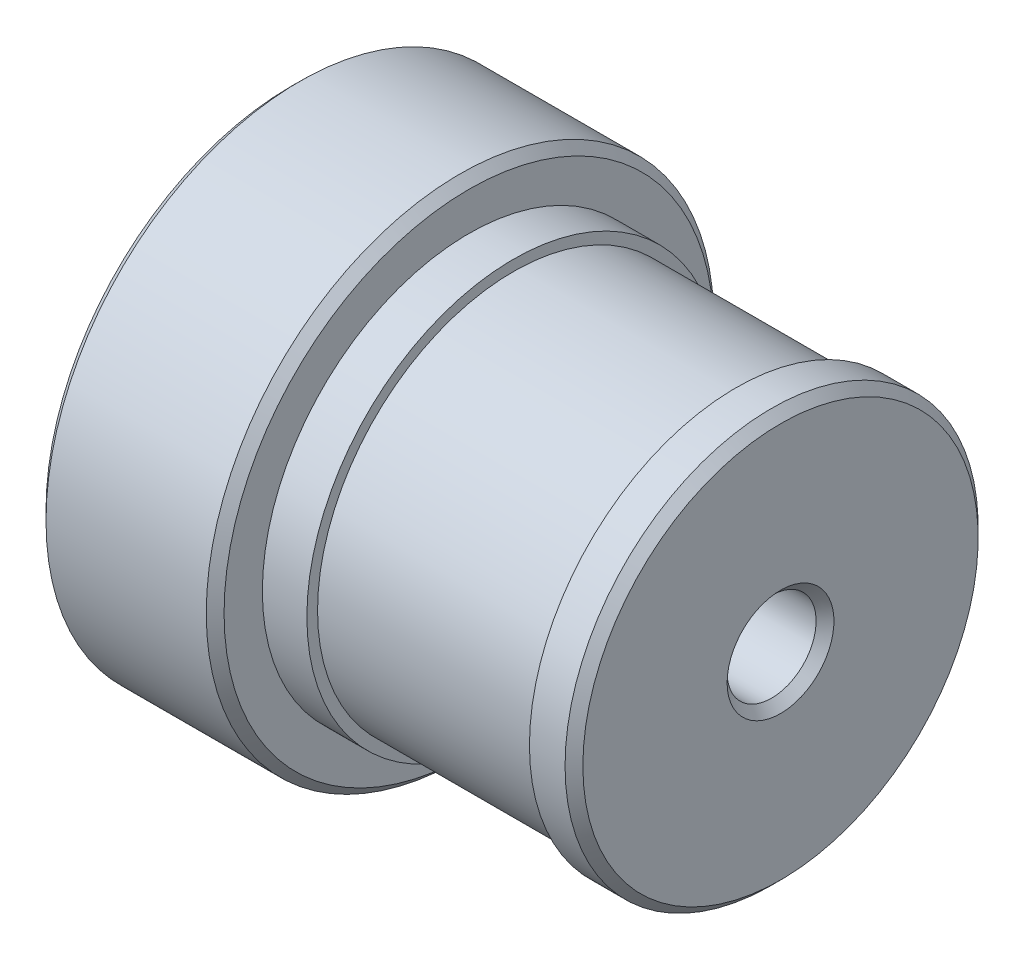
ISO-10303-21;
HEADER;
FILE_DESCRIPTION(('STEP AP214'),'2;1');
FILE_NAME('part.step','',(''),(''),'','','');
FILE_SCHEMA(('AUTOMOTIVE_DESIGN { 1 0 10303 214 1 1 1 1 }'));
ENDSEC;
DATA;
#1=APPLICATION_CONTEXT('core data for automotive mechanical design processes');
#2=APPLICATION_PROTOCOL_DEFINITION('international standard','automotive_design',2000,#1);
#3=PRODUCT_CONTEXT('',#1,'mechanical');
#4=PRODUCT('Part','Part','',(#3));
#5=PRODUCT_RELATED_PRODUCT_CATEGORY('part','',(#4));
#6=PRODUCT_DEFINITION_FORMATION('','',#4);
#7=PRODUCT_DEFINITION_CONTEXT('part definition',#1,'design');
#8=PRODUCT_DEFINITION('design','',#6,#7);
#9=PRODUCT_DEFINITION_SHAPE('','',#8);
#10=(LENGTH_UNIT() NAMED_UNIT(*) SI_UNIT(.MILLI.,.METRE.));
#11=(NAMED_UNIT(*) PLANE_ANGLE_UNIT() SI_UNIT($,.RADIAN.));
#12=(NAMED_UNIT(*) SI_UNIT($,.STERADIAN.) SOLID_ANGLE_UNIT());
#13=UNCERTAINTY_MEASURE_WITH_UNIT(LENGTH_MEASURE(1.E-05),#10,'distance_accuracy_value','');
#14=(GEOMETRIC_REPRESENTATION_CONTEXT(3) GLOBAL_UNCERTAINTY_ASSIGNED_CONTEXT((#13)) GLOBAL_UNIT_ASSIGNED_CONTEXT((#10,
#11,#12)) REPRESENTATION_CONTEXT('',''));
#15=CARTESIAN_POINT('',(0.,0.,0.));
#16=DIRECTION('',(0.,0.,1.));
#17=DIRECTION('',(1.,0.,0.));
#18=AXIS2_PLACEMENT_3D('',#15,#16,#17);
#19=CARTESIAN_POINT('',(20.,23.2,0.));
#20=DIRECTION('',(-1.,0.,0.));
#21=DIRECTION('',(0.,0.,1.));
#22=AXIS2_PLACEMENT_3D('',#19,#20,#21);
#23=PLANE('',#22);
#24=CARTESIAN_POINT('',(20.,0.,0.));
#25=DIRECTION('',(-1.,0.,0.));
#26=DIRECTION('',(0.,0.,1.));
#27=AXIS2_PLACEMENT_3D('',#24,#25,#26);
#28=CIRCLE('',#27,27.5);
#29=CARTESIAN_POINT('',(20.,0.,27.5));
#30=VERTEX_POINT('',#29);
#31=EDGE_CURVE('E59',#30,#30,#28,.F.);
#32=ORIENTED_EDGE('',*,*,#31,.T.);
#33=EDGE_LOOP('',(#32));
#34=FACE_BOUND('',#33,.T.);
#35=CARTESIAN_POINT('',(20.,0.,0.));
#36=DIRECTION('',(-1.,0.,0.));
#37=DIRECTION('',(0.,0.,1.));
#38=AXIS2_PLACEMENT_3D('',#35,#36,#37);
#39=CIRCLE('',#38,23.2);
#40=CARTESIAN_POINT('',(20.,0.,23.2));
#41=VERTEX_POINT('',#40);
#42=EDGE_CURVE('E110',#41,#41,#39,.T.);
#43=ORIENTED_EDGE('',*,*,#42,.T.);
#44=EDGE_LOOP('',(#43));
#45=FACE_BOUND('',#44,.T.);
#46=ADVANCED_FACE('F45',(#34,#45),#23,.F.);
#47=CARTESIAN_POINT('',(0.,0.,0.));
#48=DIRECTION('',(-1.,0.,0.));
#49=DIRECTION('',(0.,0.,1.));
#50=AXIS2_PLACEMENT_3D('',#47,#48,#49);
#51=CYLINDRICAL_SURFACE('',#50,28.5);
#52=CARTESIAN_POINT('',(19.,0.,0.));
#53=DIRECTION('',(-1.,0.,0.));
#54=DIRECTION('',(0.,0.,1.));
#55=AXIS2_PLACEMENT_3D('',#52,#53,#54);
#56=CIRCLE('',#55,28.5);
#57=CARTESIAN_POINT('',(19.,0.,28.5));
#58=VERTEX_POINT('',#57);
#59=EDGE_CURVE('E64',#58,#58,#56,.T.);
#60=ORIENTED_EDGE('',*,*,#59,.T.);
#61=EDGE_LOOP('',(#60));
#62=FACE_BOUND('',#61,.T.);
#63=CARTESIAN_POINT('',(0.999999999999991,0.,0.));
#64=DIRECTION('',(1.,0.,0.));
#65=DIRECTION('',(0.,0.,-1.));
#66=AXIS2_PLACEMENT_3D('',#63,#64,#65);
#67=CIRCLE('',#66,28.5);
#68=CARTESIAN_POINT('',(0.999999999999991,0.,-28.5));
#69=VERTEX_POINT('',#68);
#70=EDGE_CURVE('E70',#69,#69,#67,.T.);
#71=ORIENTED_EDGE('',*,*,#70,.T.);
#72=EDGE_LOOP('',(#71));
#73=FACE_BOUND('',#72,.T.);
#74=ADVANCED_FACE('F154',(#62,#73),#51,.T.);
#75=CARTESIAN_POINT('',(0.,5.,0.));
#76=DIRECTION('',(1.,0.,0.));
#77=DIRECTION('',(0.,0.,-1.));
#78=AXIS2_PLACEMENT_3D('',#75,#76,#77);
#79=PLANE('',#78);
#80=CARTESIAN_POINT('',(0.,0.,0.));
#81=DIRECTION('',(1.,0.,0.));
#82=DIRECTION('',(0.,0.,-1.));
#83=AXIS2_PLACEMENT_3D('',#80,#81,#82);
#84=CIRCLE('',#83,6.00000000000001);
#85=CARTESIAN_POINT('',(0.,0.,-6.00000000000001));
#86=VERTEX_POINT('',#85);
#87=EDGE_CURVE('E10',#86,#86,#84,.T.);
#88=ORIENTED_EDGE('',*,*,#87,.T.);
#89=EDGE_LOOP('',(#88));
#90=FACE_BOUND('',#89,.T.);
#91=CARTESIAN_POINT('',(0.,0.,0.));
#92=DIRECTION('',(1.,0.,0.));
#93=DIRECTION('',(0.,0.,-1.));
#94=AXIS2_PLACEMENT_3D('',#91,#92,#93);
#95=CIRCLE('',#94,27.5);
#96=CARTESIAN_POINT('',(0.,0.,-27.5));
#97=VERTEX_POINT('',#96);
#98=EDGE_CURVE('E54',#97,#97,#95,.F.);
#99=ORIENTED_EDGE('',*,*,#98,.T.);
#100=EDGE_LOOP('',(#99));
#101=FACE_BOUND('',#100,.T.);
#102=ADVANCED_FACE('F160',(#90,#101),#79,.F.);
#103=CARTESIAN_POINT('',(0.,0.,0.));
#104=DIRECTION('',(-1.,0.,0.));
#105=DIRECTION('',(0.,0.,1.));
#106=AXIS2_PLACEMENT_3D('',#103,#104,#105);
#107=CYLINDRICAL_SURFACE('',#106,5.);
#108=CARTESIAN_POINT('',(54.,0.,0.));
#109=DIRECTION('',(-1.,0.,0.));
#110=DIRECTION('',(0.,0.,1.));
#111=AXIS2_PLACEMENT_3D('',#108,#109,#110);
#112=CIRCLE('',#111,5.);
#113=CARTESIAN_POINT('',(54.,0.,5.));
#114=VERTEX_POINT('',#113);
#115=EDGE_CURVE('E78',#114,#114,#112,.F.);
#116=ORIENTED_EDGE('',*,*,#115,.T.);
#117=EDGE_LOOP('',(#116));
#118=FACE_BOUND('',#117,.T.);
#119=CARTESIAN_POINT('',(0.999999999999995,0.,0.));
#120=DIRECTION('',(1.,0.,0.));
#121=DIRECTION('',(0.,0.,-1.));
#122=AXIS2_PLACEMENT_3D('',#119,#120,#121);
#123=CIRCLE('',#122,5.);
#124=CARTESIAN_POINT('',(0.999999999999995,0.,-5.));
#125=VERTEX_POINT('',#124);
#126=EDGE_CURVE('E82',#125,#125,#123,.F.);
#127=ORIENTED_EDGE('',*,*,#126,.T.);
#128=EDGE_LOOP('',(#127));
#129=FACE_BOUND('',#128,.T.);
#130=ADVANCED_FACE('F150',(#118,#129),#107,.F.);
#131=CARTESIAN_POINT('',(55.,23.2,0.));
#132=DIRECTION('',(-1.,0.,0.));
#133=DIRECTION('',(0.,0.,1.));
#134=AXIS2_PLACEMENT_3D('',#131,#132,#133);
#135=PLANE('',#134);
#136=CARTESIAN_POINT('',(55.,0.,0.));
#137=DIRECTION('',(-1.,0.,0.));
#138=DIRECTION('',(0.,0.,1.));
#139=AXIS2_PLACEMENT_3D('',#136,#137,#138);
#140=CIRCLE('',#139,6.00000000000001);
#141=CARTESIAN_POINT('',(55.,0.,6.00000000000001));
#142=VERTEX_POINT('',#141);
#143=EDGE_CURVE('E86',#142,#142,#140,.T.);
#144=ORIENTED_EDGE('',*,*,#143,.T.);
#145=EDGE_LOOP('',(#144));
#146=FACE_BOUND('',#145,.T.);
#147=CARTESIAN_POINT('',(55.,0.,0.));
#148=DIRECTION('',(-1.,0.,0.));
#149=DIRECTION('',(0.,0.,1.));
#150=AXIS2_PLACEMENT_3D('',#147,#148,#149);
#151=CIRCLE('',#150,22.2);
#152=CARTESIAN_POINT('',(55.,0.,22.2));
#153=VERTEX_POINT('',#152);
#154=EDGE_CURVE('E90',#153,#153,#151,.F.);
#155=ORIENTED_EDGE('',*,*,#154,.T.);
#156=EDGE_LOOP('',(#155));
#157=FACE_BOUND('',#156,.T.);
#158=ADVANCED_FACE('F143',(#146,#157),#135,.F.);
#159=CARTESIAN_POINT('',(0.,0.,0.));
#160=DIRECTION('',(-1.,0.,0.));
#161=DIRECTION('',(0.,0.,1.));
#162=AXIS2_PLACEMENT_3D('',#159,#160,#161);
#163=CYLINDRICAL_SURFACE('',#162,23.2);
#164=CARTESIAN_POINT('',(54.,0.,0.));
#165=DIRECTION('',(-1.,0.,0.));
#166=DIRECTION('',(0.,0.,1.));
#167=AXIS2_PLACEMENT_3D('',#164,#165,#166);
#168=CIRCLE('',#167,23.2);
#169=CARTESIAN_POINT('',(54.,0.,23.2));
#170=VERTEX_POINT('',#169);
#171=EDGE_CURVE('E74',#170,#170,#168,.T.);
#172=ORIENTED_EDGE('',*,*,#171,.T.);
#173=EDGE_LOOP('',(#172));
#174=FACE_BOUND('',#173,.T.);
#175=CARTESIAN_POINT('',(50.,0.,0.));
#176=DIRECTION('',(-1.,0.,0.));
#177=DIRECTION('',(0.,0.,1.));
#178=AXIS2_PLACEMENT_3D('',#175,#176,#177);
#179=CIRCLE('',#178,23.2);
#180=CARTESIAN_POINT('',(50.,0.,23.2));
#181=VERTEX_POINT('',#180);
#182=EDGE_CURVE('E94',#181,#181,#179,.T.);
#183=ORIENTED_EDGE('',*,*,#182,.F.);
#184=EDGE_LOOP('',(#183));
#185=FACE_BOUND('',#184,.T.);
#186=ADVANCED_FACE('F138',(#174,#185),#163,.T.);
#187=CARTESIAN_POINT('',(50.,22.,0.));
#188=DIRECTION('',(1.,0.,0.));
#189=DIRECTION('',(0.,0.,-1.));
#190=AXIS2_PLACEMENT_3D('',#187,#188,#189);
#191=PLANE('',#190);
#192=CARTESIAN_POINT('',(50.,0.,0.));
#193=DIRECTION('',(-1.,0.,0.));
#194=DIRECTION('',(0.,0.,1.));
#195=AXIS2_PLACEMENT_3D('',#192,#193,#194);
#196=CIRCLE('',#195,22.);
#197=CARTESIAN_POINT('',(50.,0.,22.));
#198=VERTEX_POINT('',#197);
#199=EDGE_CURVE('E98',#198,#198,#196,.T.);
#200=ORIENTED_EDGE('',*,*,#199,.F.);
#201=EDGE_LOOP('',(#200));
#202=FACE_BOUND('',#201,.T.);
#203=ORIENTED_EDGE('',*,*,#182,.T.);
#204=EDGE_LOOP('',(#203));
#205=FACE_BOUND('',#204,.T.);
#206=ADVANCED_FACE('F132',(#202,#205),#191,.F.);
#207=CARTESIAN_POINT('',(0.,0.,0.));
#208=DIRECTION('',(-1.,0.,0.));
#209=DIRECTION('',(0.,0.,1.));
#210=AXIS2_PLACEMENT_3D('',#207,#208,#209);
#211=CYLINDRICAL_SURFACE('',#210,22.);
#212=CARTESIAN_POINT('',(25.,0.,0.));
#213=DIRECTION('',(-1.,0.,0.));
#214=DIRECTION('',(0.,0.,1.));
#215=AXIS2_PLACEMENT_3D('',#212,#213,#214);
#216=CIRCLE('',#215,22.);
#217=CARTESIAN_POINT('',(25.,0.,22.));
#218=VERTEX_POINT('',#217);
#219=EDGE_CURVE('E102',#218,#218,#216,.T.);
#220=ORIENTED_EDGE('',*,*,#219,.F.);
#221=EDGE_LOOP('',(#220));
#222=FACE_BOUND('',#221,.T.);
#223=ORIENTED_EDGE('',*,*,#199,.T.);
#224=EDGE_LOOP('',(#223));
#225=FACE_BOUND('',#224,.T.);
#226=ADVANCED_FACE('F126',(#222,#225),#211,.T.);
#227=CARTESIAN_POINT('',(25.,23.2,0.));
#228=DIRECTION('',(-1.,0.,0.));
#229=DIRECTION('',(0.,0.,1.));
#230=AXIS2_PLACEMENT_3D('',#227,#228,#229);
#231=PLANE('',#230);
#232=CARTESIAN_POINT('',(25.,0.,0.));
#233=DIRECTION('',(-1.,0.,0.));
#234=DIRECTION('',(0.,0.,1.));
#235=AXIS2_PLACEMENT_3D('',#232,#233,#234);
#236=CIRCLE('',#235,23.2);
#237=CARTESIAN_POINT('',(25.,0.,23.2));
#238=VERTEX_POINT('',#237);
#239=EDGE_CURVE('E106',#238,#238,#236,.T.);
#240=ORIENTED_EDGE('',*,*,#239,.F.);
#241=EDGE_LOOP('',(#240));
#242=FACE_BOUND('',#241,.T.);
#243=ORIENTED_EDGE('',*,*,#219,.T.);
#244=EDGE_LOOP('',(#243));
#245=FACE_BOUND('',#244,.T.);
#246=ADVANCED_FACE('F120',(#242,#245),#231,.F.);
#247=CARTESIAN_POINT('',(0.,0.,0.));
#248=DIRECTION('',(-1.,0.,0.));
#249=DIRECTION('',(0.,0.,1.));
#250=AXIS2_PLACEMENT_3D('',#247,#248,#249);
#251=CYLINDRICAL_SURFACE('',#250,23.2);
#252=ORIENTED_EDGE('',*,*,#42,.F.);
#253=EDGE_LOOP('',(#252));
#254=FACE_BOUND('',#253,.T.);
#255=ORIENTED_EDGE('',*,*,#239,.T.);
#256=EDGE_LOOP('',(#255));
#257=FACE_BOUND('',#256,.T.);
#258=ADVANCED_FACE('F116',(#254,#257),#251,.T.);
#259=CARTESIAN_POINT('',(55.,0.,0.));
#260=DIRECTION('',(1.,0.,0.));
#261=DIRECTION('',(0.,0.,-1.));
#262=AXIS2_PLACEMENT_3D('',#259,#260,#261);
#263=CONICAL_SURFACE('',#262,6.00000000000001,0.78539816339745);
#264=ORIENTED_EDGE('',*,*,#115,.F.);
#265=EDGE_LOOP('',(#264));
#266=FACE_BOUND('',#265,.T.);
#267=ORIENTED_EDGE('',*,*,#143,.F.);
#268=EDGE_LOOP('',(#267));
#269=FACE_BOUND('',#268,.T.);
#270=ADVANCED_FACE('F119',(#266,#269),#263,.F.);
#271=CARTESIAN_POINT('',(54.,0.,0.));
#272=DIRECTION('',(-1.,0.,0.));
#273=DIRECTION('',(0.,0.,1.));
#274=AXIS2_PLACEMENT_3D('',#271,#272,#273);
#275=CONICAL_SURFACE('',#274,23.2,0.785398163397457);
#276=ORIENTED_EDGE('',*,*,#154,.F.);
#277=EDGE_LOOP('',(#276));
#278=FACE_BOUND('',#277,.T.);
#279=ORIENTED_EDGE('',*,*,#171,.F.);
#280=EDGE_LOOP('',(#279));
#281=FACE_BOUND('',#280,.T.);
#282=ADVANCED_FACE('F170',(#278,#281),#275,.T.);
#283=CARTESIAN_POINT('',(19.,0.,0.));
#284=DIRECTION('',(-1.,0.,0.));
#285=DIRECTION('',(0.,0.,1.));
#286=AXIS2_PLACEMENT_3D('',#283,#284,#285);
#287=CONICAL_SURFACE('',#286,28.5,0.785398163397452);
#288=ORIENTED_EDGE('',*,*,#31,.F.);
#289=EDGE_LOOP('',(#288));
#290=FACE_BOUND('',#289,.T.);
#291=ORIENTED_EDGE('',*,*,#59,.F.);
#292=EDGE_LOOP('',(#291));
#293=FACE_BOUND('',#292,.T.);
#294=ADVANCED_FACE('F177',(#290,#293),#287,.T.);
#295=CARTESIAN_POINT('',(0.999999999999995,0.,0.));
#296=DIRECTION('',(-1.,0.,0.));
#297=DIRECTION('',(0.,0.,1.));
#298=AXIS2_PLACEMENT_3D('',#295,#296,#297);
#299=CONICAL_SURFACE('',#298,5.,0.785398163397453);
#300=ORIENTED_EDGE('',*,*,#87,.F.);
#301=EDGE_LOOP('',(#300));
#302=FACE_BOUND('',#301,.T.);
#303=ORIENTED_EDGE('',*,*,#126,.F.);
#304=EDGE_LOOP('',(#303));
#305=FACE_BOUND('',#304,.T.);
#306=ADVANCED_FACE('F183',(#302,#305),#299,.F.);
#307=CARTESIAN_POINT('',(0.,0.,0.));
#308=DIRECTION('',(1.,0.,0.));
#309=DIRECTION('',(0.,0.,-1.));
#310=AXIS2_PLACEMENT_3D('',#307,#308,#309);
#311=CONICAL_SURFACE('',#310,27.5,0.785398163397454);
#312=ORIENTED_EDGE('',*,*,#70,.F.);
#313=EDGE_LOOP('',(#312));
#314=FACE_BOUND('',#313,.T.);
#315=ORIENTED_EDGE('',*,*,#98,.F.);
#316=EDGE_LOOP('',(#315));
#317=FACE_BOUND('',#316,.T.);
#318=ADVANCED_FACE('F48',(#314,#317),#311,.T.);
#319=CLOSED_SHELL('',(#46,#74,#102,#130,#158,#186,#206,#226,#246,#258,#270,#282,#294,#306,#318));
#320=MANIFOLD_SOLID_BREP('B2',#319);
#321=ADVANCED_BREP_SHAPE_REPRESENTATION('',(#18,#320),#14);
#322=SHAPE_DEFINITION_REPRESENTATION(#9,#321);
ENDSEC;
END-ISO-10303-21;
